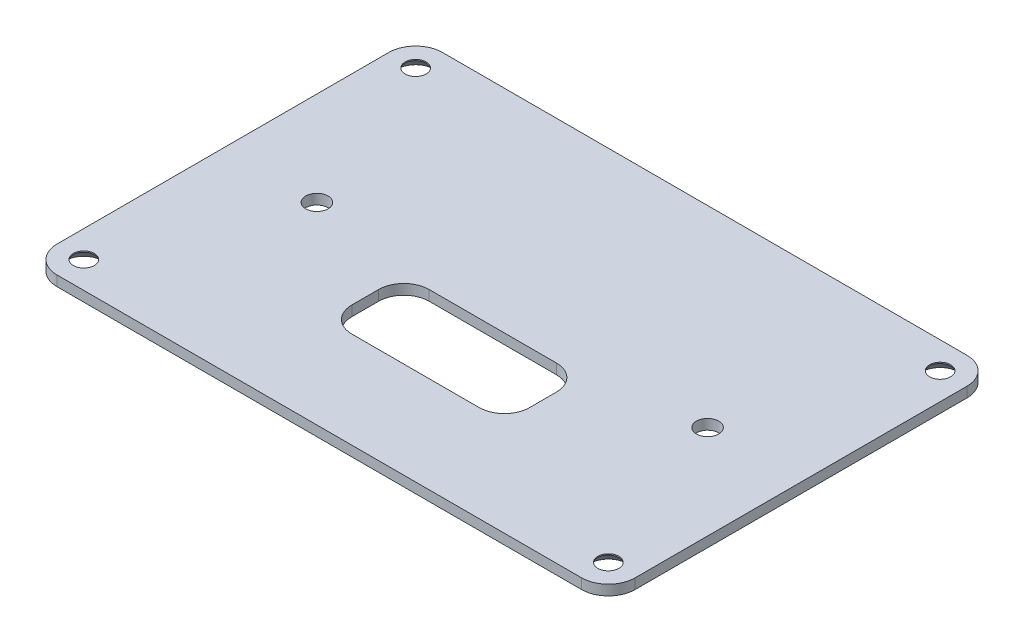
ISO-10303-21;
HEADER;
FILE_DESCRIPTION(('STEP AP214'),'2;1');
FILE_NAME('part.step','',(''),(''),'','','');
FILE_SCHEMA(('AUTOMOTIVE_DESIGN { 1 0 10303 214 1 1 1 1 }'));
ENDSEC;
DATA;
#1=APPLICATION_CONTEXT('core data for automotive mechanical design processes');
#2=APPLICATION_PROTOCOL_DEFINITION('international standard','automotive_design',2000,#1);
#3=PRODUCT_CONTEXT('',#1,'mechanical');
#4=PRODUCT('Part','Part','',(#3));
#5=PRODUCT_RELATED_PRODUCT_CATEGORY('part','',(#4));
#6=PRODUCT_DEFINITION_FORMATION('','',#4);
#7=PRODUCT_DEFINITION_CONTEXT('part definition',#1,'design');
#8=PRODUCT_DEFINITION('design','',#6,#7);
#9=PRODUCT_DEFINITION_SHAPE('','',#8);
#10=(LENGTH_UNIT() NAMED_UNIT(*) SI_UNIT(.MILLI.,.METRE.));
#11=(NAMED_UNIT(*) PLANE_ANGLE_UNIT() SI_UNIT($,.RADIAN.));
#12=(NAMED_UNIT(*) SI_UNIT($,.STERADIAN.) SOLID_ANGLE_UNIT());
#13=UNCERTAINTY_MEASURE_WITH_UNIT(LENGTH_MEASURE(1.E-05),#10,'distance_accuracy_value','');
#14=(GEOMETRIC_REPRESENTATION_CONTEXT(3) GLOBAL_UNCERTAINTY_ASSIGNED_CONTEXT((#13)) GLOBAL_UNIT_ASSIGNED_CONTEXT((#10,
#11,#12)) REPRESENTATION_CONTEXT('',''));
#15=CARTESIAN_POINT('',(0.,0.,0.));
#16=DIRECTION('',(0.,0.,1.));
#17=DIRECTION('',(1.,0.,0.));
#18=AXIS2_PLACEMENT_3D('',#15,#16,#17);
#19=CARTESIAN_POINT('',(-40.8250000000001,1.5875,-25.8250000000001));
#20=DIRECTION('',(0.,1.,0.));
#21=DIRECTION('',(0.,0.,1.));
#22=AXIS2_PLACEMENT_3D('',#19,#20,#21);
#23=PLANE('',#22);
#24=CARTESIAN_POINT('',(30.382,1.5875,-0.0614872263166575));
#25=DIRECTION('',(0.,-1.,0.));
#26=DIRECTION('',(0.,0.,-1.));
#27=AXIS2_PLACEMENT_3D('',#24,#25,#26);
#28=CIRCLE('',#27,1.7399);
#29=CARTESIAN_POINT('',(30.382,1.5875,-1.80138722631666));
#30=VERTEX_POINT('',#29);
#31=EDGE_CURVE('E427',#30,#30,#28,.T.);
#32=ORIENTED_EDGE('',*,*,#31,.T.);
#33=EDGE_LOOP('',(#32));
#34=FACE_BOUND('',#33,.T.);
#35=CARTESIAN_POINT('',(-30.3819999999999,1.5875,-0.00901752783329522));
#36=DIRECTION('',(0.,-1.,0.));
#37=DIRECTION('',(0.,0.,-1.));
#38=AXIS2_PLACEMENT_3D('',#35,#36,#37);
#39=CIRCLE('',#38,1.7399);
#40=CARTESIAN_POINT('',(-30.3819999999999,1.5875,-1.7489175278333));
#41=VERTEX_POINT('',#40);
#42=EDGE_CURVE('E423',#41,#41,#39,.T.);
#43=ORIENTED_EDGE('',*,*,#42,.T.);
#44=EDGE_LOOP('',(#43));
#45=FACE_BOUND('',#44,.T.);
#46=CARTESIAN_POINT('',(-40.8250000000001,1.5875,-25.8250000000001));
#47=DIRECTION('',(0.,-1.,0.));
#48=DIRECTION('',(0.,0.,-1.));
#49=AXIS2_PLACEMENT_3D('',#46,#47,#48);
#50=CIRCLE('',#49,1.63195);
#51=CARTESIAN_POINT('',(-40.8250000000001,1.5875,-27.4569500000001));
#52=VERTEX_POINT('',#51);
#53=EDGE_CURVE('E405',#52,#52,#50,.T.);
#54=ORIENTED_EDGE('',*,*,#53,.T.);
#55=EDGE_LOOP('',(#54));
#56=FACE_BOUND('',#55,.T.);
#57=CARTESIAN_POINT('',(40.8250000000001,1.5875,25.8250000000001));
#58=DIRECTION('',(0.,-1.,0.));
#59=DIRECTION('',(0.,0.,-1.));
#60=AXIS2_PLACEMENT_3D('',#57,#58,#59);
#61=CIRCLE('',#60,1.63195);
#62=CARTESIAN_POINT('',(40.8250000000001,1.5875,24.1930500000001));
#63=VERTEX_POINT('',#62);
#64=EDGE_CURVE('E394',#63,#63,#61,.T.);
#65=ORIENTED_EDGE('',*,*,#64,.T.);
#66=EDGE_LOOP('',(#65));
#67=FACE_BOUND('',#66,.T.);
#68=CARTESIAN_POINT('',(40.8250000000001,1.5875,-25.8250000000001));
#69=DIRECTION('',(0.,-1.,0.));
#70=DIRECTION('',(0.,0.,-1.));
#71=AXIS2_PLACEMENT_3D('',#68,#69,#70);
#72=CIRCLE('',#71,1.63195);
#73=CARTESIAN_POINT('',(40.8250000000001,1.5875,-27.4569500000001));
#74=VERTEX_POINT('',#73);
#75=EDGE_CURVE('E181',#74,#74,#72,.T.);
#76=ORIENTED_EDGE('',*,*,#75,.T.);
#77=EDGE_LOOP('',(#76));
#78=FACE_BOUND('',#77,.T.);
#79=CARTESIAN_POINT('',(-9.90600000000007,1.5875,6.92461449189326));
#80=DIRECTION('',(0.,-1.,0.));
#81=DIRECTION('',(0.,0.,-1.));
#82=AXIS2_PLACEMENT_3D('',#79,#80,#81);
#83=CIRCLE('',#82,3.929);
#84=CARTESIAN_POINT('',(-13.8350000000001,1.5875,6.92461449288326));
#85=VERTEX_POINT('',#84);
#86=CARTESIAN_POINT('',(-9.90599999792557,1.5875,2.99561449189324));
#87=VERTEX_POINT('',#86);
#88=EDGE_CURVE('E159',#85,#87,#83,.T.);
#89=ORIENTED_EDGE('',*,*,#88,.T.);
#90=DIRECTION('',(1.,0.,0.));
#91=VECTOR('',#90,1.);
#92=CARTESIAN_POINT('',(-9.90599999792557,1.5875,2.99561449189324));
#93=LINE('',#92,#91);
#94=CARTESIAN_POINT('',(9.9059999999467,1.5875,2.99561449189177));
#95=VERTEX_POINT('',#94);
#96=EDGE_CURVE('E168',#87,#95,#93,.T.);
#97=ORIENTED_EDGE('',*,*,#96,.T.);
#98=CARTESIAN_POINT('',(9.90599999999999,1.5875,6.92461449189326));
#99=DIRECTION('',(0.,-1.,0.));
#100=DIRECTION('',(0.,0.,-1.));
#101=AXIS2_PLACEMENT_3D('',#98,#99,#100);
#102=CIRCLE('',#101,3.92900000000074);
#103=CARTESIAN_POINT('',(13.835,1.5875,6.92461449208851));
#104=VERTEX_POINT('',#103);
#105=EDGE_CURVE('E59',#95,#104,#102,.T.);
#106=ORIENTED_EDGE('',*,*,#105,.T.);
#107=DIRECTION('',(0.,0.,1.));
#108=VECTOR('',#107,1.);
#109=CARTESIAN_POINT('',(13.835,1.5875,6.92461449208851));
#110=LINE('',#109,#108);
#111=CARTESIAN_POINT('',(13.835,1.5875,11.0902144920402));
#112=VERTEX_POINT('',#111);
#113=EDGE_CURVE('E185',#104,#112,#110,.T.);
#114=ORIENTED_EDGE('',*,*,#113,.T.);
#115=CARTESIAN_POINT('',(9.90599999999999,1.5875,11.0902144918933));
#116=DIRECTION('',(0.,-1.,0.));
#117=DIRECTION('',(0.,0.,-1.));
#118=AXIS2_PLACEMENT_3D('',#115,#116,#117);
#119=CIRCLE('',#118,3.929);
#120=CARTESIAN_POINT('',(9.905999999399,1.5875,15.0192144918933));
#121=VERTEX_POINT('',#120);
#122=EDGE_CURVE('E188',#112,#121,#119,.T.);
#123=ORIENTED_EDGE('',*,*,#122,.T.);
#124=DIRECTION('',(-1.,0.,0.));
#125=VECTOR('',#124,1.);
#126=CARTESIAN_POINT('',(-9.90599999794791,1.5875,15.0192144918933));
#127=LINE('',#126,#125);
#128=CARTESIAN_POINT('',(-9.90599999794791,1.5875,15.0192144918933));
#129=VERTEX_POINT('',#128);
#130=EDGE_CURVE('E191',#121,#129,#127,.T.);
#131=ORIENTED_EDGE('',*,*,#130,.T.);
#132=CARTESIAN_POINT('',(-9.90600000000007,1.5875,11.0902144918933));
#133=DIRECTION('',(0.,-1.,0.));
#134=DIRECTION('',(0.,0.,-1.));
#135=AXIS2_PLACEMENT_3D('',#132,#133,#134);
#136=CIRCLE('',#135,3.929);
#137=CARTESIAN_POINT('',(-13.8350000000001,1.5875,11.0902144916973));
#138=VERTEX_POINT('',#137);
#139=EDGE_CURVE('E194',#129,#138,#136,.T.);
#140=ORIENTED_EDGE('',*,*,#139,.T.);
#141=DIRECTION('',(0.,0.,-1.));
#142=VECTOR('',#141,1.);
#143=CARTESIAN_POINT('',(-13.8350000000001,1.5875,6.92461449288326));
#144=LINE('',#143,#142);
#145=EDGE_CURVE('E165',#138,#85,#144,.T.);
#146=ORIENTED_EDGE('',*,*,#145,.T.);
#147=EDGE_LOOP('',(#89,#97,#106,#114,#123,#131,#140,#146));
#148=FACE_BOUND('',#147,.T.);
#149=CARTESIAN_POINT('',(-40.8250000000001,1.5875,-25.8250000000001));
#150=DIRECTION('',(0.,1.,0.));
#151=DIRECTION('',(0.,0.,1.));
#152=AXIS2_PLACEMENT_3D('',#149,#150,#151);
#153=CIRCLE('',#152,4.17499999999999);
#154=CARTESIAN_POINT('',(-40.8250000000001,1.5875,-30.0000000000001));
#155=VERTEX_POINT('',#154);
#156=CARTESIAN_POINT('',(-45.0000000000001,1.5875,-25.8250000000001));
#157=VERTEX_POINT('',#156);
#158=EDGE_CURVE('E228',#155,#157,#153,.T.);
#159=ORIENTED_EDGE('',*,*,#158,.T.);
#160=DIRECTION('',(0.,0.,1.));
#161=VECTOR('',#160,1.);
#162=CARTESIAN_POINT('',(-45.0000000000001,1.5875,-25.8250000000001));
#163=LINE('',#162,#161);
#164=CARTESIAN_POINT('',(-45.0000000000001,1.5875,25.8250000000001));
#165=VERTEX_POINT('',#164);
#166=EDGE_CURVE('E231',#157,#165,#163,.T.);
#167=ORIENTED_EDGE('',*,*,#166,.T.);
#168=CARTESIAN_POINT('',(-40.8250000000001,1.5875,25.8250000000001));
#169=DIRECTION('',(0.,1.,0.));
#170=DIRECTION('',(0.,0.,1.));
#171=AXIS2_PLACEMENT_3D('',#168,#169,#170);
#172=CIRCLE('',#171,4.17500000000001);
#173=CARTESIAN_POINT('',(-40.8250000000001,1.5875,30.0000000000001));
#174=VERTEX_POINT('',#173);
#175=EDGE_CURVE('E234',#165,#174,#172,.T.);
#176=ORIENTED_EDGE('',*,*,#175,.T.);
#177=DIRECTION('',(1.,0.,0.));
#178=VECTOR('',#177,1.);
#179=CARTESIAN_POINT('',(-40.8250000000001,1.5875,30.0000000000001));
#180=LINE('',#179,#178);
#181=CARTESIAN_POINT('',(40.8250000000001,1.5875,30.0000000000001));
#182=VERTEX_POINT('',#181);
#183=EDGE_CURVE('E236',#174,#182,#180,.T.);
#184=ORIENTED_EDGE('',*,*,#183,.T.);
#185=CARTESIAN_POINT('',(40.8250000000001,1.5875,25.8250000000001));
#186=DIRECTION('',(0.,1.,0.));
#187=DIRECTION('',(0.,0.,1.));
#188=AXIS2_PLACEMENT_3D('',#185,#186,#187);
#189=CIRCLE('',#188,4.17499999999999);
#190=CARTESIAN_POINT('',(45.0000000000001,1.5875,25.8250000000001));
#191=VERTEX_POINT('',#190);
#192=EDGE_CURVE('E238',#182,#191,#189,.T.);
#193=ORIENTED_EDGE('',*,*,#192,.T.);
#194=DIRECTION('',(0.,0.,-1.));
#195=VECTOR('',#194,1.);
#196=CARTESIAN_POINT('',(45.0000000000001,1.5875,-25.8250000000001));
#197=LINE('',#196,#195);
#198=CARTESIAN_POINT('',(45.0000000000001,1.5875,-25.8250000000001));
#199=VERTEX_POINT('',#198);
#200=EDGE_CURVE('E240',#191,#199,#197,.T.);
#201=ORIENTED_EDGE('',*,*,#200,.T.);
#202=CARTESIAN_POINT('',(40.8250000000001,1.5875,-25.8250000000001));
#203=DIRECTION('',(0.,1.,0.));
#204=DIRECTION('',(0.,0.,1.));
#205=AXIS2_PLACEMENT_3D('',#202,#203,#204);
#206=CIRCLE('',#205,4.175);
#207=CARTESIAN_POINT('',(40.8250000000001,1.5875,-30.0000000000001));
#208=VERTEX_POINT('',#207);
#209=EDGE_CURVE('E242',#199,#208,#206,.T.);
#210=ORIENTED_EDGE('',*,*,#209,.T.);
#211=DIRECTION('',(-1.,0.,0.));
#212=VECTOR('',#211,1.);
#213=CARTESIAN_POINT('',(-40.8250000000001,1.5875,-30.0000000000001));
#214=LINE('',#213,#212);
#215=EDGE_CURVE('E244',#208,#155,#214,.T.);
#216=ORIENTED_EDGE('',*,*,#215,.T.);
#217=EDGE_LOOP('',(#159,#167,#176,#184,#193,#201,#210,#216));
#218=FACE_BOUND('',#217,.T.);
#219=CARTESIAN_POINT('',(-40.8250000000001,1.5875,25.8250000000001));
#220=DIRECTION('',(0.,-1.,0.));
#221=DIRECTION('',(0.,0.,-1.));
#222=AXIS2_PLACEMENT_3D('',#219,#220,#221);
#223=CIRCLE('',#222,1.63195);
#224=CARTESIAN_POINT('',(-40.8250000000001,1.5875,24.1930500000001));
#225=VERTEX_POINT('',#224);
#226=EDGE_CURVE('E414',#225,#225,#223,.T.);
#227=ORIENTED_EDGE('',*,*,#226,.T.);
#228=EDGE_LOOP('',(#227));
#229=FACE_BOUND('',#228,.T.);
#230=ADVANCED_FACE('F44',(#34,#45,#56,#67,#78,#148,#218,#229),#23,.T.);
#231=CARTESIAN_POINT('',(-40.8250000000001,0.,-25.8250000000001));
#232=DIRECTION('',(0.,1.,0.));
#233=DIRECTION('',(0.,0.,1.));
#234=AXIS2_PLACEMENT_3D('',#231,#232,#233);
#235=PLANE('',#234);
#236=CARTESIAN_POINT('',(30.382,0.,-0.0614872263166575));
#237=DIRECTION('',(0.,-1.,0.));
#238=DIRECTION('',(0.,0.,-1.));
#239=AXIS2_PLACEMENT_3D('',#236,#237,#238);
#240=CIRCLE('',#239,1.7399);
#241=CARTESIAN_POINT('',(30.382,0.,-1.80138722631666));
#242=VERTEX_POINT('',#241);
#243=EDGE_CURVE('E430',#242,#242,#240,.T.);
#244=ORIENTED_EDGE('',*,*,#243,.F.);
#245=EDGE_LOOP('',(#244));
#246=FACE_BOUND('',#245,.T.);
#247=CARTESIAN_POINT('',(-30.3819999999999,0.,-0.00901752783329522));
#248=DIRECTION('',(0.,-1.,0.));
#249=DIRECTION('',(0.,0.,-1.));
#250=AXIS2_PLACEMENT_3D('',#247,#248,#249);
#251=CIRCLE('',#250,1.7399);
#252=CARTESIAN_POINT('',(-30.3819999999999,0.,-1.7489175278333));
#253=VERTEX_POINT('',#252);
#254=EDGE_CURVE('E424',#253,#253,#251,.T.);
#255=ORIENTED_EDGE('',*,*,#254,.F.);
#256=EDGE_LOOP('',(#255));
#257=FACE_BOUND('',#256,.T.);
#258=CARTESIAN_POINT('',(-40.8250000000001,0.,-25.8250000000001));
#259=DIRECTION('',(0.,1.,0.));
#260=DIRECTION('',(0.,0.,1.));
#261=AXIS2_PLACEMENT_3D('',#258,#259,#260);
#262=CIRCLE('',#261,4.17499999999999);
#263=CARTESIAN_POINT('',(-40.8250000000001,0.,-30.0000000000001));
#264=VERTEX_POINT('',#263);
#265=CARTESIAN_POINT('',(-45.0000000000001,0.,-25.8250000000001));
#266=VERTEX_POINT('',#265);
#267=EDGE_CURVE('E216',#264,#266,#262,.T.);
#268=ORIENTED_EDGE('',*,*,#267,.F.);
#269=DIRECTION('',(-1.,0.,0.));
#270=VECTOR('',#269,1.);
#271=CARTESIAN_POINT('',(-40.8250000000001,0.,-30.0000000000001));
#272=LINE('',#271,#270);
#273=CARTESIAN_POINT('',(40.8250000000001,0.,-30.0000000000001));
#274=VERTEX_POINT('',#273);
#275=EDGE_CURVE('E232',#274,#264,#272,.T.);
#276=ORIENTED_EDGE('',*,*,#275,.F.);
#277=CARTESIAN_POINT('',(40.8250000000001,0.,-25.8250000000001));
#278=DIRECTION('',(0.,1.,0.));
#279=DIRECTION('',(0.,0.,1.));
#280=AXIS2_PLACEMENT_3D('',#277,#278,#279);
#281=CIRCLE('',#280,4.175);
#282=CARTESIAN_POINT('',(45.0000000000001,0.,-25.8250000000001));
#283=VERTEX_POINT('',#282);
#284=EDGE_CURVE('E259',#283,#274,#281,.T.);
#285=ORIENTED_EDGE('',*,*,#284,.F.);
#286=DIRECTION('',(0.,0.,-1.));
#287=VECTOR('',#286,1.);
#288=CARTESIAN_POINT('',(45.0000000000001,0.,-25.8250000000001));
#289=LINE('',#288,#287);
#290=CARTESIAN_POINT('',(45.0000000000001,0.,25.8250000000001));
#291=VERTEX_POINT('',#290);
#292=EDGE_CURVE('E257',#291,#283,#289,.T.);
#293=ORIENTED_EDGE('',*,*,#292,.F.);
#294=CARTESIAN_POINT('',(40.8250000000001,0.,25.8250000000001));
#295=DIRECTION('',(0.,1.,0.));
#296=DIRECTION('',(0.,0.,1.));
#297=AXIS2_PLACEMENT_3D('',#294,#295,#296);
#298=CIRCLE('',#297,4.17499999999999);
#299=CARTESIAN_POINT('',(40.8250000000001,0.,30.0000000000001));
#300=VERTEX_POINT('',#299);
#301=EDGE_CURVE('E255',#300,#291,#298,.T.);
#302=ORIENTED_EDGE('',*,*,#301,.F.);
#303=DIRECTION('',(1.,0.,0.));
#304=VECTOR('',#303,1.);
#305=CARTESIAN_POINT('',(-40.8250000000001,0.,30.0000000000001));
#306=LINE('',#305,#304);
#307=CARTESIAN_POINT('',(-40.8250000000001,0.,30.0000000000001));
#308=VERTEX_POINT('',#307);
#309=EDGE_CURVE('E253',#308,#300,#306,.T.);
#310=ORIENTED_EDGE('',*,*,#309,.F.);
#311=CARTESIAN_POINT('',(-40.8250000000001,0.,25.8250000000001));
#312=DIRECTION('',(0.,1.,0.));
#313=DIRECTION('',(0.,0.,1.));
#314=AXIS2_PLACEMENT_3D('',#311,#312,#313);
#315=CIRCLE('',#314,4.17500000000001);
#316=CARTESIAN_POINT('',(-45.0000000000001,0.,25.8250000000001));
#317=VERTEX_POINT('',#316);
#318=EDGE_CURVE('E251',#317,#308,#315,.T.);
#319=ORIENTED_EDGE('',*,*,#318,.F.);
#320=DIRECTION('',(0.,0.,1.));
#321=VECTOR('',#320,1.);
#322=CARTESIAN_POINT('',(-45.0000000000001,0.,-25.8250000000001));
#323=LINE('',#322,#321);
#324=EDGE_CURVE('E249',#266,#317,#323,.T.);
#325=ORIENTED_EDGE('',*,*,#324,.F.);
#326=EDGE_LOOP('',(#268,#276,#285,#293,#302,#310,#319,#325));
#327=FACE_BOUND('',#326,.T.);
#328=DIRECTION('',(1.,0.,0.));
#329=VECTOR('',#328,1.);
#330=CARTESIAN_POINT('',(-9.90599999792557,0.,2.99561449189324));
#331=LINE('',#330,#329);
#332=CARTESIAN_POINT('',(-9.90599999792557,0.,2.99561449189324));
#333=VERTEX_POINT('',#332);
#334=CARTESIAN_POINT('',(9.90599999994671,0.,2.9956144918925));
#335=VERTEX_POINT('',#334);
#336=EDGE_CURVE('E198',#333,#335,#331,.T.);
#337=ORIENTED_EDGE('',*,*,#336,.F.);
#338=CARTESIAN_POINT('',(-9.90600000000007,0.,6.92461449189326));
#339=DIRECTION('',(0.,-1.,0.));
#340=DIRECTION('',(0.,0.,-1.));
#341=AXIS2_PLACEMENT_3D('',#338,#339,#340);
#342=CIRCLE('',#341,3.929);
#343=CARTESIAN_POINT('',(-13.8350000000001,0.,6.92461449288326));
#344=VERTEX_POINT('',#343);
#345=EDGE_CURVE('E67',#344,#333,#342,.T.);
#346=ORIENTED_EDGE('',*,*,#345,.F.);
#347=DIRECTION('',(0.,0.,-1.));
#348=VECTOR('',#347,1.);
#349=CARTESIAN_POINT('',(-13.8350000000001,0.,6.92461449288326));
#350=LINE('',#349,#348);
#351=CARTESIAN_POINT('',(-13.8350000000001,0.,11.0902144916973));
#352=VERTEX_POINT('',#351);
#353=EDGE_CURVE('E175',#352,#344,#350,.T.);
#354=ORIENTED_EDGE('',*,*,#353,.F.);
#355=CARTESIAN_POINT('',(-9.90600000000007,0.,11.0902144918933));
#356=DIRECTION('',(0.,-1.,0.));
#357=DIRECTION('',(0.,0.,-1.));
#358=AXIS2_PLACEMENT_3D('',#355,#356,#357);
#359=CIRCLE('',#358,3.929);
#360=CARTESIAN_POINT('',(-9.90599999794791,0.,15.0192144918933));
#361=VERTEX_POINT('',#360);
#362=EDGE_CURVE('E178',#361,#352,#359,.T.);
#363=ORIENTED_EDGE('',*,*,#362,.F.);
#364=DIRECTION('',(-1.,0.,0.));
#365=VECTOR('',#364,1.);
#366=CARTESIAN_POINT('',(-9.90599999794791,0.,15.0192144918933));
#367=LINE('',#366,#365);
#368=CARTESIAN_POINT('',(9.905999999399,0.,15.0192144918933));
#369=VERTEX_POINT('',#368);
#370=EDGE_CURVE('E209',#369,#361,#367,.T.);
#371=ORIENTED_EDGE('',*,*,#370,.F.);
#372=CARTESIAN_POINT('',(9.90599999999999,0.,11.0902144918933));
#373=DIRECTION('',(0.,-1.,0.));
#374=DIRECTION('',(0.,0.,-1.));
#375=AXIS2_PLACEMENT_3D('',#372,#373,#374);
#376=CIRCLE('',#375,3.929);
#377=CARTESIAN_POINT('',(13.835,0.,11.0902144920402));
#378=VERTEX_POINT('',#377);
#379=EDGE_CURVE('E206',#378,#369,#376,.T.);
#380=ORIENTED_EDGE('',*,*,#379,.F.);
#381=DIRECTION('',(0.,0.,1.));
#382=VECTOR('',#381,1.);
#383=CARTESIAN_POINT('',(13.835,0.,6.92461449208851));
#384=LINE('',#383,#382);
#385=CARTESIAN_POINT('',(13.835,0.,6.92461449208851));
#386=VERTEX_POINT('',#385);
#387=EDGE_CURVE('E203',#386,#378,#384,.T.);
#388=ORIENTED_EDGE('',*,*,#387,.F.);
#389=CARTESIAN_POINT('',(9.90599999999999,0.,6.92461449189326));
#390=DIRECTION('',(0.,-1.,0.));
#391=DIRECTION('',(0.,0.,-1.));
#392=AXIS2_PLACEMENT_3D('',#389,#390,#391);
#393=CIRCLE('',#392,3.92900000000074);
#394=EDGE_CURVE('E200',#335,#386,#393,.T.);
#395=ORIENTED_EDGE('',*,*,#394,.F.);
#396=EDGE_LOOP('',(#337,#346,#354,#363,#371,#380,#388,#395));
#397=FACE_BOUND('',#396,.T.);
#398=CARTESIAN_POINT('',(40.8250000000001,0.,-25.8250000000001));
#399=DIRECTION('',(0.,-1.,0.));
#400=DIRECTION('',(0.,0.,-1.));
#401=AXIS2_PLACEMENT_3D('',#398,#399,#400);
#402=CIRCLE('',#401,2.8575);
#403=CARTESIAN_POINT('',(40.8250000000001,0.,-28.6825000000001));
#404=VERTEX_POINT('',#403);
#405=EDGE_CURVE('E392',#404,#404,#402,.T.);
#406=ORIENTED_EDGE('',*,*,#405,.F.);
#407=EDGE_LOOP('',(#406));
#408=FACE_BOUND('',#407,.T.);
#409=CARTESIAN_POINT('',(40.8250000000001,0.,25.8250000000001));
#410=DIRECTION('',(0.,-1.,0.));
#411=DIRECTION('',(0.,0.,-1.));
#412=AXIS2_PLACEMENT_3D('',#409,#410,#411);
#413=CIRCLE('',#412,2.8575);
#414=CARTESIAN_POINT('',(40.8250000000001,0.,22.9675000000001));
#415=VERTEX_POINT('',#414);
#416=EDGE_CURVE('E402',#415,#415,#413,.T.);
#417=ORIENTED_EDGE('',*,*,#416,.F.);
#418=EDGE_LOOP('',(#417));
#419=FACE_BOUND('',#418,.T.);
#420=CARTESIAN_POINT('',(-40.8250000000001,0.,-25.8250000000001));
#421=DIRECTION('',(0.,-1.,0.));
#422=DIRECTION('',(0.,0.,-1.));
#423=AXIS2_PLACEMENT_3D('',#420,#421,#422);
#424=CIRCLE('',#423,2.8575);
#425=CARTESIAN_POINT('',(-40.8250000000001,0.,-28.6825000000001));
#426=VERTEX_POINT('',#425);
#427=EDGE_CURVE('E411',#426,#426,#424,.T.);
#428=ORIENTED_EDGE('',*,*,#427,.F.);
#429=EDGE_LOOP('',(#428));
#430=FACE_BOUND('',#429,.T.);
#431=CARTESIAN_POINT('',(-40.8250000000001,0.,25.8250000000001));
#432=DIRECTION('',(0.,-1.,0.));
#433=DIRECTION('',(0.,0.,-1.));
#434=AXIS2_PLACEMENT_3D('',#431,#432,#433);
#435=CIRCLE('',#434,2.8575);
#436=CARTESIAN_POINT('',(-40.8250000000001,0.,22.9675000000001));
#437=VERTEX_POINT('',#436);
#438=EDGE_CURVE('E420',#437,#437,#435,.T.);
#439=ORIENTED_EDGE('',*,*,#438,.F.);
#440=EDGE_LOOP('',(#439));
#441=FACE_BOUND('',#440,.T.);
#442=ADVANCED_FACE('F289',(#246,#257,#327,#397,#408,#419,#430,#441),#235,.F.);
#443=CARTESIAN_POINT('',(-40.8250000000001,1.5875,-25.8250000000001));
#444=DIRECTION('',(0.,-1.,0.));
#445=DIRECTION('',(0.,0.,-1.));
#446=AXIS2_PLACEMENT_3D('',#443,#444,#445);
#447=CYLINDRICAL_SURFACE('',#446,4.17499999999999);
#448=ORIENTED_EDGE('',*,*,#267,.T.);
#449=DIRECTION('',(0.,-1.,0.));
#450=VECTOR('',#449,1.);
#451=CARTESIAN_POINT('',(-45.0000000000001,1.5875,-25.8250000000001));
#452=LINE('',#451,#450);
#453=EDGE_CURVE('E13',#157,#266,#452,.T.);
#454=ORIENTED_EDGE('',*,*,#453,.F.);
#455=ORIENTED_EDGE('',*,*,#158,.F.);
#456=DIRECTION('',(0.,-1.,0.));
#457=VECTOR('',#456,1.);
#458=CARTESIAN_POINT('',(-40.8250000000001,1.5875,-30.0000000000001));
#459=LINE('',#458,#457);
#460=EDGE_CURVE('E246',#155,#264,#459,.T.);
#461=ORIENTED_EDGE('',*,*,#460,.T.);
#462=EDGE_LOOP('',(#448,#454,#455,#461));
#463=FACE_BOUND('',#462,.T.);
#464=ADVANCED_FACE('F46',(#463),#447,.T.);
#465=CARTESIAN_POINT('',(-45.0000000000001,1.5875,-25.8250000000001));
#466=DIRECTION('',(1.,0.,0.));
#467=DIRECTION('',(0.,0.,-1.));
#468=AXIS2_PLACEMENT_3D('',#465,#466,#467);
#469=PLANE('',#468);
#470=ORIENTED_EDGE('',*,*,#324,.T.);
#471=DIRECTION('',(0.,-1.,0.));
#472=VECTOR('',#471,1.);
#473=CARTESIAN_POINT('',(-45.0000000000001,1.5875,25.8250000000001));
#474=LINE('',#473,#472);
#475=EDGE_CURVE('E52',#165,#317,#474,.T.);
#476=ORIENTED_EDGE('',*,*,#475,.F.);
#477=ORIENTED_EDGE('',*,*,#166,.F.);
#478=ORIENTED_EDGE('',*,*,#453,.T.);
#479=EDGE_LOOP('',(#470,#476,#477,#478));
#480=FACE_BOUND('',#479,.T.);
#481=ADVANCED_FACE('F306',(#480),#469,.F.);
#482=CARTESIAN_POINT('',(-40.8250000000001,1.5875,25.8250000000001));
#483=DIRECTION('',(0.,-1.,0.));
#484=DIRECTION('',(0.,0.,-1.));
#485=AXIS2_PLACEMENT_3D('',#482,#483,#484);
#486=CYLINDRICAL_SURFACE('',#485,4.17500000000001);
#487=ORIENTED_EDGE('',*,*,#318,.T.);
#488=DIRECTION('',(0.,-1.,0.));
#489=VECTOR('',#488,1.);
#490=CARTESIAN_POINT('',(-40.8250000000001,1.5875,30.0000000000001));
#491=LINE('',#490,#489);
#492=EDGE_CURVE('E276',#174,#308,#491,.T.);
#493=ORIENTED_EDGE('',*,*,#492,.F.);
#494=ORIENTED_EDGE('',*,*,#175,.F.);
#495=ORIENTED_EDGE('',*,*,#475,.T.);
#496=EDGE_LOOP('',(#487,#493,#494,#495));
#497=FACE_BOUND('',#496,.T.);
#498=ADVANCED_FACE('F283',(#497),#486,.T.);
#499=CARTESIAN_POINT('',(-40.8250000000001,1.5875,30.0000000000001));
#500=DIRECTION('',(0.,0.,-1.));
#501=DIRECTION('',(-1.,0.,0.));
#502=AXIS2_PLACEMENT_3D('',#499,#500,#501);
#503=PLANE('',#502);
#504=ORIENTED_EDGE('',*,*,#309,.T.);
#505=DIRECTION('',(0.,-1.,0.));
#506=VECTOR('',#505,1.);
#507=CARTESIAN_POINT('',(40.8250000000001,1.5875,30.0000000000001));
#508=LINE('',#507,#506);
#509=EDGE_CURVE('E273',#182,#300,#508,.T.);
#510=ORIENTED_EDGE('',*,*,#509,.F.);
#511=ORIENTED_EDGE('',*,*,#183,.F.);
#512=ORIENTED_EDGE('',*,*,#492,.T.);
#513=EDGE_LOOP('',(#504,#510,#511,#512));
#514=FACE_BOUND('',#513,.T.);
#515=ADVANCED_FACE('F295',(#514),#503,.F.);
#516=CARTESIAN_POINT('',(40.8250000000001,1.5875,25.8250000000001));
#517=DIRECTION('',(0.,-1.,0.));
#518=DIRECTION('',(0.,0.,-1.));
#519=AXIS2_PLACEMENT_3D('',#516,#517,#518);
#520=CYLINDRICAL_SURFACE('',#519,4.17499999999999);
#521=ORIENTED_EDGE('',*,*,#301,.T.);
#522=DIRECTION('',(0.,-1.,0.));
#523=VECTOR('',#522,1.);
#524=CARTESIAN_POINT('',(45.0000000000001,1.5875,25.8250000000001));
#525=LINE('',#524,#523);
#526=EDGE_CURVE('E270',#191,#291,#525,.T.);
#527=ORIENTED_EDGE('',*,*,#526,.F.);
#528=ORIENTED_EDGE('',*,*,#192,.F.);
#529=ORIENTED_EDGE('',*,*,#509,.T.);
#530=EDGE_LOOP('',(#521,#527,#528,#529));
#531=FACE_BOUND('',#530,.T.);
#532=ADVANCED_FACE('F299',(#531),#520,.T.);
#533=CARTESIAN_POINT('',(45.0000000000001,1.5875,-25.8250000000001));
#534=DIRECTION('',(-1.,0.,0.));
#535=DIRECTION('',(0.,0.,1.));
#536=AXIS2_PLACEMENT_3D('',#533,#534,#535);
#537=PLANE('',#536);
#538=ORIENTED_EDGE('',*,*,#292,.T.);
#539=DIRECTION('',(0.,-1.,0.));
#540=VECTOR('',#539,1.);
#541=CARTESIAN_POINT('',(45.0000000000001,1.5875,-25.8250000000001));
#542=LINE('',#541,#540);
#543=EDGE_CURVE('E267',#199,#283,#542,.T.);
#544=ORIENTED_EDGE('',*,*,#543,.F.);
#545=ORIENTED_EDGE('',*,*,#200,.F.);
#546=ORIENTED_EDGE('',*,*,#526,.T.);
#547=EDGE_LOOP('',(#538,#544,#545,#546));
#548=FACE_BOUND('',#547,.T.);
#549=ADVANCED_FACE('F319',(#548),#537,.F.);
#550=CARTESIAN_POINT('',(40.8250000000001,1.5875,-25.8250000000001));
#551=DIRECTION('',(0.,-1.,0.));
#552=DIRECTION('',(0.,0.,-1.));
#553=AXIS2_PLACEMENT_3D('',#550,#551,#552);
#554=CYLINDRICAL_SURFACE('',#553,4.175);
#555=ORIENTED_EDGE('',*,*,#284,.T.);
#556=DIRECTION('',(0.,-1.,0.));
#557=VECTOR('',#556,1.);
#558=CARTESIAN_POINT('',(40.8250000000001,1.5875,-30.0000000000001));
#559=LINE('',#558,#557);
#560=EDGE_CURVE('E264',#208,#274,#559,.T.);
#561=ORIENTED_EDGE('',*,*,#560,.F.);
#562=ORIENTED_EDGE('',*,*,#209,.F.);
#563=ORIENTED_EDGE('',*,*,#543,.T.);
#564=EDGE_LOOP('',(#555,#561,#562,#563));
#565=FACE_BOUND('',#564,.T.);
#566=ADVANCED_FACE('F317',(#565),#554,.T.);
#567=CARTESIAN_POINT('',(-40.8250000000001,1.5875,-30.0000000000001));
#568=DIRECTION('',(0.,0.,1.));
#569=DIRECTION('',(1.,0.,0.));
#570=AXIS2_PLACEMENT_3D('',#567,#568,#569);
#571=PLANE('',#570);
#572=ORIENTED_EDGE('',*,*,#275,.T.);
#573=ORIENTED_EDGE('',*,*,#460,.F.);
#574=ORIENTED_EDGE('',*,*,#215,.F.);
#575=ORIENTED_EDGE('',*,*,#560,.T.);
#576=EDGE_LOOP('',(#572,#573,#574,#575));
#577=FACE_BOUND('',#576,.T.);
#578=ADVANCED_FACE('F312',(#577),#571,.F.);
#579=CARTESIAN_POINT('',(-9.90600000000007,1.5875,6.92461449189326));
#580=DIRECTION('',(0.,-1.,0.));
#581=DIRECTION('',(0.,0.,-1.));
#582=AXIS2_PLACEMENT_3D('',#579,#580,#581);
#583=CYLINDRICAL_SURFACE('',#582,3.929);
#584=ORIENTED_EDGE('',*,*,#345,.T.);
#585=DIRECTION('',(0.,-1.,0.));
#586=VECTOR('',#585,1.);
#587=CARTESIAN_POINT('',(-9.90599999792557,1.5875,2.99561449189324));
#588=LINE('',#587,#586);
#589=EDGE_CURVE('E155',#87,#333,#588,.T.);
#590=ORIENTED_EDGE('',*,*,#589,.F.);
#591=ORIENTED_EDGE('',*,*,#88,.F.);
#592=DIRECTION('',(0.,-1.,0.));
#593=VECTOR('',#592,1.);
#594=CARTESIAN_POINT('',(-13.8350000000001,1.5875,6.92461449288326));
#595=LINE('',#594,#593);
#596=EDGE_CURVE('E214',#85,#344,#595,.T.);
#597=ORIENTED_EDGE('',*,*,#596,.T.);
#598=EDGE_LOOP('',(#584,#590,#591,#597));
#599=FACE_BOUND('',#598,.T.);
#600=ADVANCED_FACE('F157',(#599),#583,.F.);
#601=CARTESIAN_POINT('',(-13.8350000000001,1.5875,6.92461449288326));
#602=DIRECTION('',(-1.,0.,0.));
#603=DIRECTION('',(0.,0.,1.));
#604=AXIS2_PLACEMENT_3D('',#601,#602,#603);
#605=PLANE('',#604);
#606=ORIENTED_EDGE('',*,*,#353,.T.);
#607=ORIENTED_EDGE('',*,*,#596,.F.);
#608=ORIENTED_EDGE('',*,*,#145,.F.);
#609=DIRECTION('',(0.,-1.,0.));
#610=VECTOR('',#609,1.);
#611=CARTESIAN_POINT('',(-13.8350000000001,1.5875,11.0902144916973));
#612=LINE('',#611,#610);
#613=EDGE_CURVE('E217',#138,#352,#612,.T.);
#614=ORIENTED_EDGE('',*,*,#613,.T.);
#615=EDGE_LOOP('',(#606,#607,#608,#614));
#616=FACE_BOUND('',#615,.T.);
#617=ADVANCED_FACE('F345',(#616),#605,.F.);
#618=CARTESIAN_POINT('',(-9.90600000000007,1.5875,11.0902144918933));
#619=DIRECTION('',(0.,-1.,0.));
#620=DIRECTION('',(0.,0.,-1.));
#621=AXIS2_PLACEMENT_3D('',#618,#619,#620);
#622=CYLINDRICAL_SURFACE('',#621,3.929);
#623=ORIENTED_EDGE('',*,*,#362,.T.);
#624=ORIENTED_EDGE('',*,*,#613,.F.);
#625=ORIENTED_EDGE('',*,*,#139,.F.);
#626=DIRECTION('',(0.,-1.,0.));
#627=VECTOR('',#626,1.);
#628=CARTESIAN_POINT('',(-9.90599999794791,1.5875,15.0192144918933));
#629=LINE('',#628,#627);
#630=EDGE_CURVE('E219',#129,#361,#629,.T.);
#631=ORIENTED_EDGE('',*,*,#630,.T.);
#632=EDGE_LOOP('',(#623,#624,#625,#631));
#633=FACE_BOUND('',#632,.T.);
#634=ADVANCED_FACE('F349',(#633),#622,.F.);
#635=CARTESIAN_POINT('',(-9.90599999794791,1.5875,15.0192144918933));
#636=DIRECTION('',(0.,0.,1.));
#637=DIRECTION('',(1.,0.,0.));
#638=AXIS2_PLACEMENT_3D('',#635,#636,#637);
#639=PLANE('',#638);
#640=ORIENTED_EDGE('',*,*,#370,.T.);
#641=ORIENTED_EDGE('',*,*,#630,.F.);
#642=ORIENTED_EDGE('',*,*,#130,.F.);
#643=DIRECTION('',(0.,-1.,0.));
#644=VECTOR('',#643,1.);
#645=CARTESIAN_POINT('',(9.905999999399,1.5875,15.0192144918933));
#646=LINE('',#645,#644);
#647=EDGE_CURVE('E221',#121,#369,#646,.T.);
#648=ORIENTED_EDGE('',*,*,#647,.T.);
#649=EDGE_LOOP('',(#640,#641,#642,#648));
#650=FACE_BOUND('',#649,.T.);
#651=ADVANCED_FACE('F355',(#650),#639,.F.);
#652=CARTESIAN_POINT('',(9.90599999999999,1.5875,11.0902144918933));
#653=DIRECTION('',(0.,-1.,0.));
#654=DIRECTION('',(0.,0.,-1.));
#655=AXIS2_PLACEMENT_3D('',#652,#653,#654);
#656=CYLINDRICAL_SURFACE('',#655,3.929);
#657=ORIENTED_EDGE('',*,*,#379,.T.);
#658=ORIENTED_EDGE('',*,*,#647,.F.);
#659=ORIENTED_EDGE('',*,*,#122,.F.);
#660=DIRECTION('',(0.,-1.,0.));
#661=VECTOR('',#660,1.);
#662=CARTESIAN_POINT('',(13.835,1.5875,11.0902144920402));
#663=LINE('',#662,#661);
#664=EDGE_CURVE('E223',#112,#378,#663,.T.);
#665=ORIENTED_EDGE('',*,*,#664,.T.);
#666=EDGE_LOOP('',(#657,#658,#659,#665));
#667=FACE_BOUND('',#666,.T.);
#668=ADVANCED_FACE('F364',(#667),#656,.F.);
#669=CARTESIAN_POINT('',(13.835,1.5875,6.92461449208851));
#670=DIRECTION('',(1.,0.,0.));
#671=DIRECTION('',(0.,0.,-1.));
#672=AXIS2_PLACEMENT_3D('',#669,#670,#671);
#673=PLANE('',#672);
#674=ORIENTED_EDGE('',*,*,#387,.T.);
#675=ORIENTED_EDGE('',*,*,#664,.F.);
#676=ORIENTED_EDGE('',*,*,#113,.F.);
#677=DIRECTION('',(0.,-1.,0.));
#678=VECTOR('',#677,1.);
#679=CARTESIAN_POINT('',(13.835,1.5875,6.92461449208851));
#680=LINE('',#679,#678);
#681=EDGE_CURVE('E225',#104,#386,#680,.T.);
#682=ORIENTED_EDGE('',*,*,#681,.T.);
#683=EDGE_LOOP('',(#674,#675,#676,#682));
#684=FACE_BOUND('',#683,.T.);
#685=ADVANCED_FACE('F368',(#684),#673,.F.);
#686=CARTESIAN_POINT('',(9.90599999999999,1.5875,6.92461449189326));
#687=DIRECTION('',(0.,-1.,0.));
#688=DIRECTION('',(0.,0.,-1.));
#689=AXIS2_PLACEMENT_3D('',#686,#687,#688);
#690=CYLINDRICAL_SURFACE('',#689,3.92900000000074);
#691=ORIENTED_EDGE('',*,*,#394,.T.);
#692=ORIENTED_EDGE('',*,*,#681,.F.);
#693=ORIENTED_EDGE('',*,*,#105,.F.);
#694=DIRECTION('',(0.,-1.,0.));
#695=VECTOR('',#694,1.);
#696=CARTESIAN_POINT('',(9.90599999994671,1.5875,2.9956144918925));
#697=LINE('',#696,#695);
#698=EDGE_CURVE('E164',#95,#335,#697,.T.);
#699=ORIENTED_EDGE('',*,*,#698,.T.);
#700=EDGE_LOOP('',(#691,#692,#693,#699));
#701=FACE_BOUND('',#700,.T.);
#702=ADVANCED_FACE('F372',(#701),#690,.F.);
#703=CARTESIAN_POINT('',(-9.90599999792557,1.5875,2.99561449189324));
#704=DIRECTION('',(0.,0.,-1.));
#705=DIRECTION('',(-1.,0.,0.));
#706=AXIS2_PLACEMENT_3D('',#703,#704,#705);
#707=PLANE('',#706);
#708=ORIENTED_EDGE('',*,*,#336,.T.);
#709=ORIENTED_EDGE('',*,*,#698,.F.);
#710=ORIENTED_EDGE('',*,*,#96,.F.);
#711=ORIENTED_EDGE('',*,*,#589,.T.);
#712=EDGE_LOOP('',(#708,#709,#710,#711));
#713=FACE_BOUND('',#712,.T.);
#714=ADVANCED_FACE('F169',(#713),#707,.F.);
#715=CARTESIAN_POINT('',(40.8250000000001,0.,-25.8250000000001));
#716=DIRECTION('',(0.,-1.,0.));
#717=DIRECTION('',(0.,0.,-1.));
#718=AXIS2_PLACEMENT_3D('',#715,#716,#717);
#719=CYLINDRICAL_SURFACE('',#718,1.63195);
#720=ORIENTED_EDGE('',*,*,#75,.F.);
#721=EDGE_LOOP('',(#720));
#722=FACE_BOUND('',#721,.T.);
#723=CARTESIAN_POINT('',(40.8250000000001,1.40983400146971,-25.8250000000001));
#724=DIRECTION('',(0.,-1.,0.));
#725=DIRECTION('',(0.,0.,-1.));
#726=AXIS2_PLACEMENT_3D('',#723,#724,#725);
#727=CIRCLE('',#726,1.63195);
#728=CARTESIAN_POINT('',(40.8250000000001,1.40983400146971,-27.4569500000001));
#729=VERTEX_POINT('',#728);
#730=EDGE_CURVE('E391',#729,#729,#727,.T.);
#731=ORIENTED_EDGE('',*,*,#730,.T.);
#732=EDGE_LOOP('',(#731));
#733=FACE_BOUND('',#732,.T.);
#734=ADVANCED_FACE('F359',(#722,#733),#719,.F.);
#735=CARTESIAN_POINT('',(40.8250000000001,0.,-25.8250000000001));
#736=DIRECTION('',(0.,-1.,0.));
#737=DIRECTION('',(0.,0.,-1.));
#738=AXIS2_PLACEMENT_3D('',#735,#736,#737);
#739=CONICAL_SURFACE('',#738,2.8575,0.715584993317674);
#740=ORIENTED_EDGE('',*,*,#730,.F.);
#741=EDGE_LOOP('',(#740));
#742=FACE_BOUND('',#741,.T.);
#743=ORIENTED_EDGE('',*,*,#405,.T.);
#744=EDGE_LOOP('',(#743));
#745=FACE_BOUND('',#744,.T.);
#746=ADVANCED_FACE('F379',(#742,#745),#739,.F.);
#747=CARTESIAN_POINT('',(40.8250000000001,0.,25.8250000000001));
#748=DIRECTION('',(0.,-1.,0.));
#749=DIRECTION('',(0.,0.,-1.));
#750=AXIS2_PLACEMENT_3D('',#747,#748,#749);
#751=CYLINDRICAL_SURFACE('',#750,1.63195);
#752=ORIENTED_EDGE('',*,*,#64,.F.);
#753=EDGE_LOOP('',(#752));
#754=FACE_BOUND('',#753,.T.);
#755=CARTESIAN_POINT('',(40.8250000000001,1.40983400146971,25.8250000000001));
#756=DIRECTION('',(0.,-1.,0.));
#757=DIRECTION('',(0.,0.,-1.));
#758=AXIS2_PLACEMENT_3D('',#755,#756,#757);
#759=CIRCLE('',#758,1.63195);
#760=CARTESIAN_POINT('',(40.8250000000001,1.40983400146971,24.1930500000001));
#761=VERTEX_POINT('',#760);
#762=EDGE_CURVE('E399',#761,#761,#759,.T.);
#763=ORIENTED_EDGE('',*,*,#762,.T.);
#764=EDGE_LOOP('',(#763));
#765=FACE_BOUND('',#764,.T.);
#766=ADVANCED_FACE('F384',(#754,#765),#751,.F.);
#767=CARTESIAN_POINT('',(40.8250000000001,0.,25.8250000000001));
#768=DIRECTION('',(0.,-1.,0.));
#769=DIRECTION('',(0.,0.,-1.));
#770=AXIS2_PLACEMENT_3D('',#767,#768,#769);
#771=CONICAL_SURFACE('',#770,2.8575,0.715584993317674);
#772=ORIENTED_EDGE('',*,*,#762,.F.);
#773=EDGE_LOOP('',(#772));
#774=FACE_BOUND('',#773,.T.);
#775=ORIENTED_EDGE('',*,*,#416,.T.);
#776=EDGE_LOOP('',(#775));
#777=FACE_BOUND('',#776,.T.);
#778=ADVANCED_FACE('F466',(#774,#777),#771,.F.);
#779=CARTESIAN_POINT('',(-40.8250000000001,0.,-25.8250000000001));
#780=DIRECTION('',(0.,-1.,0.));
#781=DIRECTION('',(0.,0.,-1.));
#782=AXIS2_PLACEMENT_3D('',#779,#780,#781);
#783=CYLINDRICAL_SURFACE('',#782,1.63195);
#784=ORIENTED_EDGE('',*,*,#53,.F.);
#785=EDGE_LOOP('',(#784));
#786=FACE_BOUND('',#785,.T.);
#787=CARTESIAN_POINT('',(-40.8250000000001,1.40983400146971,-25.8250000000001));
#788=DIRECTION('',(0.,-1.,0.));
#789=DIRECTION('',(0.,0.,-1.));
#790=AXIS2_PLACEMENT_3D('',#787,#788,#789);
#791=CIRCLE('',#790,1.63195);
#792=CARTESIAN_POINT('',(-40.8250000000001,1.40983400146971,-27.4569500000001));
#793=VERTEX_POINT('',#792);
#794=EDGE_CURVE('E408',#793,#793,#791,.T.);
#795=ORIENTED_EDGE('',*,*,#794,.T.);
#796=EDGE_LOOP('',(#795));
#797=FACE_BOUND('',#796,.T.);
#798=ADVANCED_FACE('F462',(#786,#797),#783,.F.);
#799=CARTESIAN_POINT('',(-40.8250000000001,0.,-25.8250000000001));
#800=DIRECTION('',(0.,-1.,0.));
#801=DIRECTION('',(0.,0.,-1.));
#802=AXIS2_PLACEMENT_3D('',#799,#800,#801);
#803=CONICAL_SURFACE('',#802,2.8575,0.715584993317674);
#804=ORIENTED_EDGE('',*,*,#794,.F.);
#805=EDGE_LOOP('',(#804));
#806=FACE_BOUND('',#805,.T.);
#807=ORIENTED_EDGE('',*,*,#427,.T.);
#808=EDGE_LOOP('',(#807));
#809=FACE_BOUND('',#808,.T.);
#810=ADVANCED_FACE('F458',(#806,#809),#803,.F.);
#811=CARTESIAN_POINT('',(-40.8250000000001,0.,25.8250000000001));
#812=DIRECTION('',(0.,-1.,0.));
#813=DIRECTION('',(0.,0.,-1.));
#814=AXIS2_PLACEMENT_3D('',#811,#812,#813);
#815=CYLINDRICAL_SURFACE('',#814,1.63195);
#816=ORIENTED_EDGE('',*,*,#226,.F.);
#817=EDGE_LOOP('',(#816));
#818=FACE_BOUND('',#817,.T.);
#819=CARTESIAN_POINT('',(-40.8250000000001,1.40983400146971,25.8250000000001));
#820=DIRECTION('',(0.,-1.,0.));
#821=DIRECTION('',(0.,0.,-1.));
#822=AXIS2_PLACEMENT_3D('',#819,#820,#821);
#823=CIRCLE('',#822,1.63195);
#824=CARTESIAN_POINT('',(-40.8250000000001,1.40983400146971,24.1930500000001));
#825=VERTEX_POINT('',#824);
#826=EDGE_CURVE('E417',#825,#825,#823,.T.);
#827=ORIENTED_EDGE('',*,*,#826,.T.);
#828=EDGE_LOOP('',(#827));
#829=FACE_BOUND('',#828,.T.);
#830=ADVANCED_FACE('F451',(#818,#829),#815,.F.);
#831=CARTESIAN_POINT('',(-40.8250000000001,0.,25.8250000000001));
#832=DIRECTION('',(0.,-1.,0.));
#833=DIRECTION('',(0.,0.,-1.));
#834=AXIS2_PLACEMENT_3D('',#831,#832,#833);
#835=CONICAL_SURFACE('',#834,2.8575,0.715584993317674);
#836=ORIENTED_EDGE('',*,*,#826,.F.);
#837=EDGE_LOOP('',(#836));
#838=FACE_BOUND('',#837,.T.);
#839=ORIENTED_EDGE('',*,*,#438,.T.);
#840=EDGE_LOOP('',(#839));
#841=FACE_BOUND('',#840,.T.);
#842=ADVANCED_FACE('F445',(#838,#841),#835,.F.);
#843=CARTESIAN_POINT('',(-30.3819999999999,1.5875,-0.00901752783329522));
#844=DIRECTION('',(0.,-1.,0.));
#845=DIRECTION('',(0.,0.,-1.));
#846=AXIS2_PLACEMENT_3D('',#843,#844,#845);
#847=CYLINDRICAL_SURFACE('',#846,1.7399);
#848=ORIENTED_EDGE('',*,*,#42,.F.);
#849=EDGE_LOOP('',(#848));
#850=FACE_BOUND('',#849,.T.);
#851=ORIENTED_EDGE('',*,*,#254,.T.);
#852=EDGE_LOOP('',(#851));
#853=FACE_BOUND('',#852,.T.);
#854=ADVANCED_FACE('F438',(#850,#853),#847,.F.);
#855=CARTESIAN_POINT('',(30.382,1.5875,-0.0614872263166575));
#856=DIRECTION('',(0.,-1.,0.));
#857=DIRECTION('',(0.,0.,-1.));
#858=AXIS2_PLACEMENT_3D('',#855,#856,#857);
#859=CYLINDRICAL_SURFACE('',#858,1.7399);
#860=ORIENTED_EDGE('',*,*,#31,.F.);
#861=EDGE_LOOP('',(#860));
#862=FACE_BOUND('',#861,.T.);
#863=ORIENTED_EDGE('',*,*,#243,.T.);
#864=EDGE_LOOP('',(#863));
#865=FACE_BOUND('',#864,.T.);
#866=ADVANCED_FACE('F435',(#862,#865),#859,.F.);
#867=CLOSED_SHELL('',(#230,#442,#464,#481,#498,#515,#532,#549,#566,#578,#600,#617,#634,#651,
#668,#685,#702,#714,#734,#746,#766,#778,#798,#810,#830,#842,#854,#866));
#868=MANIFOLD_SOLID_BREP('B2',#867);
#869=ADVANCED_BREP_SHAPE_REPRESENTATION('',(#18,#868),#14);
#870=SHAPE_DEFINITION_REPRESENTATION(#9,#869);
ENDSEC;
END-ISO-10303-21;
